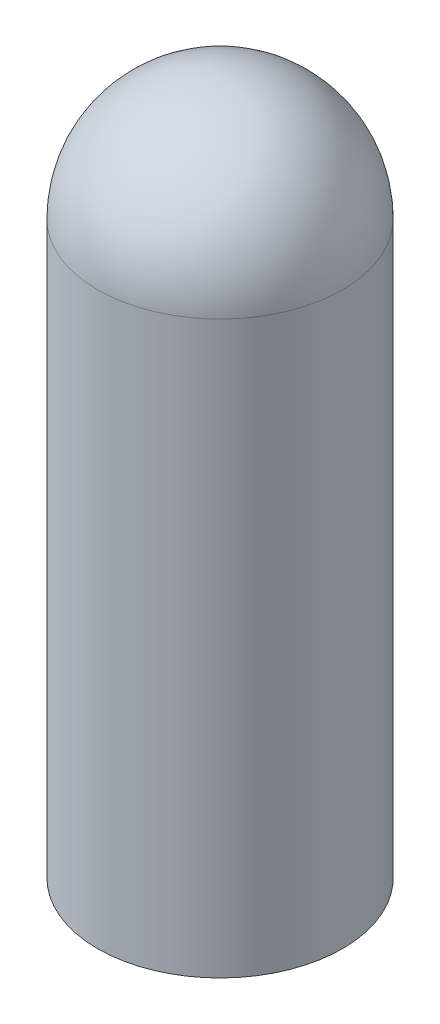
ISO-10303-21;
HEADER;
FILE_DESCRIPTION(('STEP AP214'),'2;1');
FILE_NAME('part.step','',(''),(''),'','','');
FILE_SCHEMA(('AUTOMOTIVE_DESIGN { 1 0 10303 214 1 1 1 1 }'));
ENDSEC;
DATA;
#1=APPLICATION_CONTEXT('core data for automotive mechanical design processes');
#2=APPLICATION_PROTOCOL_DEFINITION('international standard','automotive_design',2000,#1);
#3=PRODUCT_CONTEXT('',#1,'mechanical');
#4=PRODUCT('Part','Part','',(#3));
#5=PRODUCT_RELATED_PRODUCT_CATEGORY('part','',(#4));
#6=PRODUCT_DEFINITION_FORMATION('','',#4);
#7=PRODUCT_DEFINITION_CONTEXT('part definition',#1,'design');
#8=PRODUCT_DEFINITION('design','',#6,#7);
#9=PRODUCT_DEFINITION_SHAPE('','',#8);
#10=(LENGTH_UNIT() NAMED_UNIT(*) SI_UNIT(.MILLI.,.METRE.));
#11=(NAMED_UNIT(*) PLANE_ANGLE_UNIT() SI_UNIT($,.RADIAN.));
#12=(NAMED_UNIT(*) SI_UNIT($,.STERADIAN.) SOLID_ANGLE_UNIT());
#13=UNCERTAINTY_MEASURE_WITH_UNIT(LENGTH_MEASURE(1.E-05),#10,'distance_accuracy_value','');
#14=(GEOMETRIC_REPRESENTATION_CONTEXT(3) GLOBAL_UNCERTAINTY_ASSIGNED_CONTEXT((#13)) GLOBAL_UNIT_ASSIGNED_CONTEXT((#10,
#11,#12)) REPRESENTATION_CONTEXT('',''));
#15=CARTESIAN_POINT('',(0.,0.,0.));
#16=DIRECTION('',(0.,0.,1.));
#17=DIRECTION('',(1.,0.,0.));
#18=AXIS2_PLACEMENT_3D('',#15,#16,#17);
#19=CARTESIAN_POINT('',(-6.731,0.,0.));
#20=DIRECTION('',(0.,-1.,0.));
#21=DIRECTION('',(0.,0.,-1.));
#22=AXIS2_PLACEMENT_3D('',#19,#20,#21);
#23=PLANE('',#22);
#24=CARTESIAN_POINT('',(0.,0.,0.));
#25=DIRECTION('',(0.,-1.,0.));
#26=DIRECTION('',(0.,0.,-1.));
#27=AXIS2_PLACEMENT_3D('',#24,#25,#26);
#28=CIRCLE('',#27,6.35);
#29=CARTESIAN_POINT('',(0.,0.,-6.35));
#30=VERTEX_POINT('',#29);
#31=EDGE_CURVE('E48',#30,#30,#28,.T.);
#32=ORIENTED_EDGE('',*,*,#31,.F.);
#33=EDGE_LOOP('',(#32));
#34=FACE_BOUND('',#33,.T.);
#35=CARTESIAN_POINT('',(0.,0.,0.));
#36=DIRECTION('',(0.,1.,0.));
#37=DIRECTION('',(0.,0.,1.));
#38=AXIS2_PLACEMENT_3D('',#35,#36,#37);
#39=CIRCLE('',#38,6.731);
#40=CARTESIAN_POINT('',(0.,0.,6.731));
#41=VERTEX_POINT('',#40);
#42=EDGE_CURVE('E10',#41,#41,#39,.T.);
#43=ORIENTED_EDGE('',*,*,#42,.F.);
#44=EDGE_LOOP('',(#43));
#45=FACE_BOUND('',#44,.T.);
#46=ADVANCED_FACE('F34',(#34,#45),#23,.T.);
#47=CARTESIAN_POINT('',(0.,0.,0.));
#48=DIRECTION('',(0.,1.,0.));
#49=DIRECTION('',(0.,0.,1.));
#50=AXIS2_PLACEMENT_3D('',#47,#48,#49);
#51=CYLINDRICAL_SURFACE('',#50,6.731);
#52=ORIENTED_EDGE('',*,*,#42,.T.);
#53=EDGE_LOOP('',(#52));
#54=FACE_BOUND('',#53,.T.);
#55=CARTESIAN_POINT('',(0.,31.369,0.));
#56=DIRECTION('',(0.,1.,0.));
#57=DIRECTION('',(0.,0.,1.));
#58=AXIS2_PLACEMENT_3D('',#55,#56,#57);
#59=CIRCLE('',#58,6.731);
#60=CARTESIAN_POINT('',(0.,31.369,6.731));
#61=VERTEX_POINT('',#60);
#62=EDGE_CURVE('E40',#61,#61,#59,.T.);
#63=ORIENTED_EDGE('',*,*,#62,.F.);
#64=EDGE_LOOP('',(#63));
#65=FACE_BOUND('',#64,.T.);
#66=ADVANCED_FACE('F58',(#54,#65),#51,.T.);
#67=CARTESIAN_POINT('',(0.,31.369,0.));
#68=DIRECTION('',(0.,1.,0.));
#69=DIRECTION('',(-1.,0.,0.));
#70=AXIS2_PLACEMENT_3D('',#67,#68,#69);
#71=SPHERICAL_SURFACE('',#70,6.731);
#72=ORIENTED_EDGE('',*,*,#62,.T.);
#73=EDGE_LOOP('',(#72));
#74=FACE_BOUND('',#73,.T.);
#75=ADVANCED_FACE('F62',(#74),#71,.T.);
#76=CARTESIAN_POINT('',(0.,31.496,0.));
#77=DIRECTION('',(0.,-1.,0.));
#78=DIRECTION('',(0.,0.,-1.));
#79=AXIS2_PLACEMENT_3D('',#76,#77,#78);
#80=CYLINDRICAL_SURFACE('',#79,6.35);
#81=CARTESIAN_POINT('',(0.,31.496,0.));
#82=DIRECTION('',(0.,-1.,0.));
#83=DIRECTION('',(0.,0.,-1.));
#84=AXIS2_PLACEMENT_3D('',#81,#82,#83);
#85=CIRCLE('',#84,6.35);
#86=CARTESIAN_POINT('',(0.,31.496,-6.35));
#87=VERTEX_POINT('',#86);
#88=EDGE_CURVE('E44',#87,#87,#85,.T.);
#89=ORIENTED_EDGE('',*,*,#88,.F.);
#90=EDGE_LOOP('',(#89));
#91=FACE_BOUND('',#90,.T.);
#92=ORIENTED_EDGE('',*,*,#31,.T.);
#93=EDGE_LOOP('',(#92));
#94=FACE_BOUND('',#93,.T.);
#95=ADVANCED_FACE('F54',(#91,#94),#80,.F.);
#96=CARTESIAN_POINT('',(0.,31.496,0.));
#97=DIRECTION('',(0.,-1.,0.));
#98=DIRECTION('',(0.,0.,-1.));
#99=AXIS2_PLACEMENT_3D('',#96,#97,#98);
#100=PLANE('',#99);
#101=ORIENTED_EDGE('',*,*,#88,.T.);
#102=EDGE_LOOP('',(#101));
#103=FACE_BOUND('',#102,.T.);
#104=ADVANCED_FACE('F71',(#103),#100,.T.);
#105=CLOSED_SHELL('',(#46,#66,#75,#95,#104));
#106=MANIFOLD_SOLID_BREP('B2',#105);
#107=ADVANCED_BREP_SHAPE_REPRESENTATION('',(#18,#106),#14);
#108=SHAPE_DEFINITION_REPRESENTATION(#9,#107);
ENDSEC;
END-ISO-10303-21;
